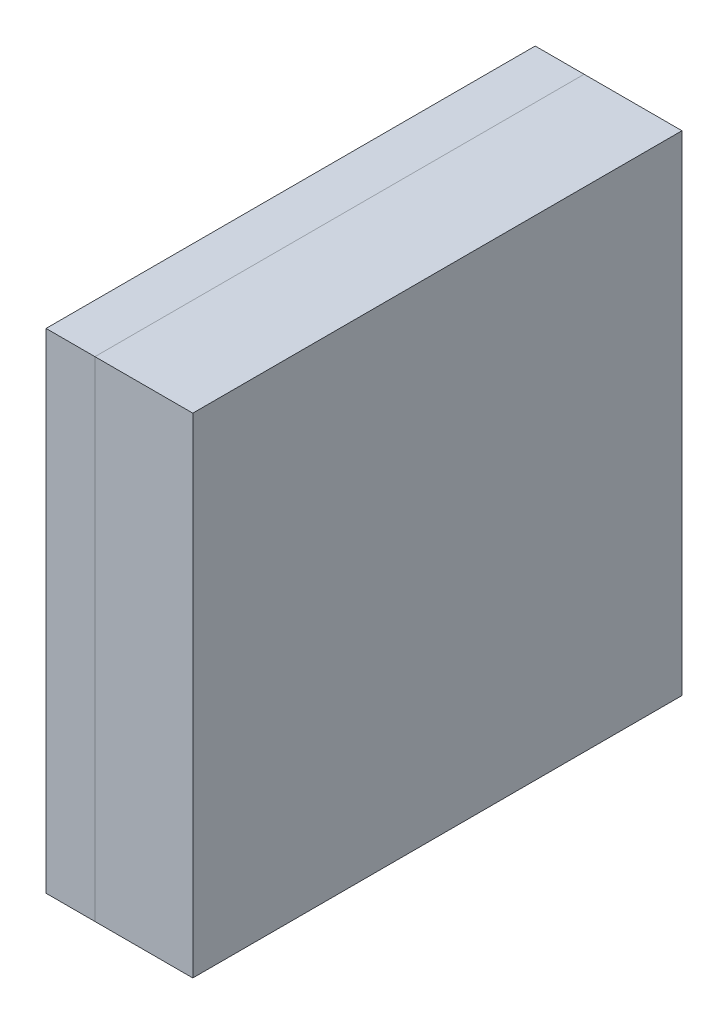
ISO-10303-21;
HEADER;
FILE_DESCRIPTION(('STEP AP214'),'2;1');
FILE_NAME('part.step','',(''),(''),'','','');
FILE_SCHEMA(('AUTOMOTIVE_DESIGN { 1 0 10303 214 1 1 1 1 }'));
ENDSEC;
DATA;
#1=APPLICATION_CONTEXT('core data for automotive mechanical design processes');
#2=APPLICATION_PROTOCOL_DEFINITION('international standard','automotive_design',2000,#1);
#3=PRODUCT_CONTEXT('',#1,'mechanical');
#4=PRODUCT('Part','Part','',(#3));
#5=PRODUCT_RELATED_PRODUCT_CATEGORY('part','',(#4));
#6=PRODUCT_DEFINITION_FORMATION('','',#4);
#7=PRODUCT_DEFINITION_CONTEXT('part definition',#1,'design');
#8=PRODUCT_DEFINITION('design','',#6,#7);
#9=PRODUCT_DEFINITION_SHAPE('','',#8);
#10=(LENGTH_UNIT() NAMED_UNIT(*) SI_UNIT(.MILLI.,.METRE.));
#11=(NAMED_UNIT(*) PLANE_ANGLE_UNIT() SI_UNIT($,.RADIAN.));
#12=(NAMED_UNIT(*) SI_UNIT($,.STERADIAN.) SOLID_ANGLE_UNIT());
#13=UNCERTAINTY_MEASURE_WITH_UNIT(LENGTH_MEASURE(1.E-05),#10,'distance_accuracy_value','');
#14=(GEOMETRIC_REPRESENTATION_CONTEXT(3) GLOBAL_UNCERTAINTY_ASSIGNED_CONTEXT((#13)) GLOBAL_UNIT_ASSIGNED_CONTEXT((#10,
#11,#12)) REPRESENTATION_CONTEXT('',''));
#15=CARTESIAN_POINT('',(0.,0.,0.));
#16=DIRECTION('',(0.,0.,1.));
#17=DIRECTION('',(1.,0.,0.));
#18=AXIS2_PLACEMENT_3D('',#15,#16,#17);
#19=CARTESIAN_POINT('',(300.,500.,-500.));
#20=DIRECTION('',(0.,-1.,0.));
#21=DIRECTION('',(0.,0.,-1.));
#22=AXIS2_PLACEMENT_3D('',#19,#20,#21);
#23=PLANE('',#22);
#24=DIRECTION('',(0.,0.,1.));
#25=VECTOR('',#24,1.);
#26=CARTESIAN_POINT('',(100.,500.,-500.));
#27=LINE('',#26,#25);
#28=CARTESIAN_POINT('',(100.,500.,-500.));
#29=VERTEX_POINT('',#28);
#30=CARTESIAN_POINT('',(100.,500.,500.));
#31=VERTEX_POINT('',#30);
#32=EDGE_CURVE('E128',#29,#31,#27,.T.);
#33=ORIENTED_EDGE('',*,*,#32,.T.);
#34=DIRECTION('',(-1.,0.,0.));
#35=VECTOR('',#34,1.);
#36=CARTESIAN_POINT('',(300.,500.,500.));
#37=LINE('',#36,#35);
#38=CARTESIAN_POINT('',(300.,500.,500.));
#39=VERTEX_POINT('',#38);
#40=EDGE_CURVE('E13',#39,#31,#37,.T.);
#41=ORIENTED_EDGE('',*,*,#40,.F.);
#42=DIRECTION('',(0.,0.,1.));
#43=VECTOR('',#42,1.);
#44=CARTESIAN_POINT('',(300.,500.,-500.));
#45=LINE('',#44,#43);
#46=CARTESIAN_POINT('',(300.,500.,-500.));
#47=VERTEX_POINT('',#46);
#48=EDGE_CURVE('E111',#47,#39,#45,.T.);
#49=ORIENTED_EDGE('',*,*,#48,.F.);
#50=DIRECTION('',(-1.,0.,0.));
#51=VECTOR('',#50,1.);
#52=CARTESIAN_POINT('',(300.,500.,-500.));
#53=LINE('',#52,#51);
#54=EDGE_CURVE('E123',#47,#29,#53,.T.);
#55=ORIENTED_EDGE('',*,*,#54,.T.);
#56=EDGE_LOOP('',(#33,#41,#49,#55));
#57=FACE_BOUND('',#56,.T.);
#58=ADVANCED_FACE('F59',(#57),#23,.F.);
#59=CARTESIAN_POINT('',(300.,500.,500.));
#60=DIRECTION('',(0.,0.,-1.));
#61=DIRECTION('',(-1.,0.,0.));
#62=AXIS2_PLACEMENT_3D('',#59,#60,#61);
#63=PLANE('',#62);
#64=DIRECTION('',(0.,-1.,0.));
#65=VECTOR('',#64,1.);
#66=CARTESIAN_POINT('',(100.,500.,500.));
#67=LINE('',#66,#65);
#68=CARTESIAN_POINT('',(100.,-500.,500.));
#69=VERTEX_POINT('',#68);
#70=EDGE_CURVE('E116',#31,#69,#67,.T.);
#71=ORIENTED_EDGE('',*,*,#70,.T.);
#72=DIRECTION('',(-1.,0.,0.));
#73=VECTOR('',#72,1.);
#74=CARTESIAN_POINT('',(300.,-500.,500.));
#75=LINE('',#74,#73);
#76=CARTESIAN_POINT('',(300.,-500.,500.));
#77=VERTEX_POINT('',#76);
#78=EDGE_CURVE('E68',#77,#69,#75,.T.);
#79=ORIENTED_EDGE('',*,*,#78,.F.);
#80=DIRECTION('',(0.,-1.,0.));
#81=VECTOR('',#80,1.);
#82=CARTESIAN_POINT('',(300.,500.,500.));
#83=LINE('',#82,#81);
#84=EDGE_CURVE('E106',#39,#77,#83,.T.);
#85=ORIENTED_EDGE('',*,*,#84,.F.);
#86=ORIENTED_EDGE('',*,*,#40,.T.);
#87=EDGE_LOOP('',(#71,#79,#85,#86));
#88=FACE_BOUND('',#87,.T.);
#89=ADVANCED_FACE('F115',(#88),#63,.F.);
#90=CARTESIAN_POINT('',(300.,-500.,500.));
#91=DIRECTION('',(0.,1.,0.));
#92=DIRECTION('',(0.,0.,1.));
#93=AXIS2_PLACEMENT_3D('',#90,#91,#92);
#94=PLANE('',#93);
#95=DIRECTION('',(0.,0.,-1.));
#96=VECTOR('',#95,1.);
#97=CARTESIAN_POINT('',(100.,-500.,500.));
#98=LINE('',#97,#96);
#99=CARTESIAN_POINT('',(100.,-500.,-500.));
#100=VERTEX_POINT('',#99);
#101=EDGE_CURVE('E93',#69,#100,#98,.T.);
#102=ORIENTED_EDGE('',*,*,#101,.T.);
#103=DIRECTION('',(-1.,0.,0.));
#104=VECTOR('',#103,1.);
#105=CARTESIAN_POINT('',(300.,-500.,-500.));
#106=LINE('',#105,#104);
#107=CARTESIAN_POINT('',(300.,-500.,-500.));
#108=VERTEX_POINT('',#107);
#109=EDGE_CURVE('E118',#108,#100,#106,.T.);
#110=ORIENTED_EDGE('',*,*,#109,.F.);
#111=DIRECTION('',(0.,0.,-1.));
#112=VECTOR('',#111,1.);
#113=CARTESIAN_POINT('',(300.,-500.,500.));
#114=LINE('',#113,#112);
#115=EDGE_CURVE('E109',#77,#108,#114,.T.);
#116=ORIENTED_EDGE('',*,*,#115,.F.);
#117=ORIENTED_EDGE('',*,*,#78,.T.);
#118=EDGE_LOOP('',(#102,#110,#116,#117));
#119=FACE_BOUND('',#118,.T.);
#120=ADVANCED_FACE('F119',(#119),#94,.F.);
#121=CARTESIAN_POINT('',(300.,-500.,-500.));
#122=DIRECTION('',(0.,0.,1.));
#123=DIRECTION('',(1.,0.,0.));
#124=AXIS2_PLACEMENT_3D('',#121,#122,#123);
#125=PLANE('',#124);
#126=DIRECTION('',(0.,1.,0.));
#127=VECTOR('',#126,1.);
#128=CARTESIAN_POINT('',(100.,-500.,-500.));
#129=LINE('',#128,#127);
#130=EDGE_CURVE('E99',#100,#29,#129,.T.);
#131=ORIENTED_EDGE('',*,*,#130,.T.);
#132=ORIENTED_EDGE('',*,*,#54,.F.);
#133=DIRECTION('',(0.,1.,0.));
#134=VECTOR('',#133,1.);
#135=CARTESIAN_POINT('',(300.,-500.,-500.));
#136=LINE('',#135,#134);
#137=EDGE_CURVE('E76',#108,#47,#136,.T.);
#138=ORIENTED_EDGE('',*,*,#137,.F.);
#139=ORIENTED_EDGE('',*,*,#109,.T.);
#140=EDGE_LOOP('',(#131,#132,#138,#139));
#141=FACE_BOUND('',#140,.T.);
#142=ADVANCED_FACE('F142',(#141),#125,.F.);
#143=CARTESIAN_POINT('',(300.,0.,0.));
#144=DIRECTION('',(1.,0.,0.));
#145=DIRECTION('',(0.,0.,-1.));
#146=AXIS2_PLACEMENT_3D('',#143,#144,#145);
#147=PLANE('',#146);
#148=ORIENTED_EDGE('',*,*,#48,.T.);
#149=ORIENTED_EDGE('',*,*,#84,.T.);
#150=ORIENTED_EDGE('',*,*,#115,.T.);
#151=ORIENTED_EDGE('',*,*,#137,.T.);
#152=EDGE_LOOP('',(#148,#149,#150,#151));
#153=FACE_BOUND('',#152,.T.);
#154=ADVANCED_FACE('F107',(#153),#147,.T.);
#155=CARTESIAN_POINT('',(100.,0.,0.));
#156=DIRECTION('',(1.,0.,0.));
#157=DIRECTION('',(0.,0.,-1.));
#158=AXIS2_PLACEMENT_3D('',#155,#156,#157);
#159=PLANE('',#158);
#160=ORIENTED_EDGE('',*,*,#32,.F.);
#161=ORIENTED_EDGE('',*,*,#130,.F.);
#162=ORIENTED_EDGE('',*,*,#101,.F.);
#163=ORIENTED_EDGE('',*,*,#70,.F.);
#164=EDGE_LOOP('',(#160,#161,#162,#163));
#165=FACE_BOUND('',#164,.T.);
#166=ADVANCED_FACE('F145',(#165),#159,.F.);
#167=CLOSED_SHELL('',(#58,#89,#120,#142,#154,#166));
#168=MANIFOLD_SOLID_BREP('B2',#167);
#169=CARTESIAN_POINT('',(100.,-500.,500.));
#170=DIRECTION('',(0.,0.,1.));
#171=DIRECTION('',(1.,0.,0.));
#172=AXIS2_PLACEMENT_3D('',#169,#170,#171);
#173=PLANE('',#172);
#174=DIRECTION('',(0.,1.,0.));
#175=VECTOR('',#174,1.);
#176=CARTESIAN_POINT('',(0.,-500.,500.));
#177=LINE('',#176,#175);
#178=CARTESIAN_POINT('',(0.,-500.,500.));
#179=VERTEX_POINT('',#178);
#180=CARTESIAN_POINT('',(0.,500.,500.));
#181=VERTEX_POINT('',#180);
#182=EDGE_CURVE('E277',#179,#181,#177,.T.);
#183=ORIENTED_EDGE('',*,*,#182,.F.);
#184=DIRECTION('',(-1.,0.,0.));
#185=VECTOR('',#184,1.);
#186=CARTESIAN_POINT('',(100.,-500.,500.));
#187=LINE('',#186,#185);
#188=CARTESIAN_POINT('',(100.,-500.,500.));
#189=VERTEX_POINT('',#188);
#190=EDGE_CURVE('E57',#189,#179,#187,.T.);
#191=ORIENTED_EDGE('',*,*,#190,.F.);
#192=DIRECTION('',(0.,1.,0.));
#193=VECTOR('',#192,1.);
#194=CARTESIAN_POINT('',(100.,-500.,500.));
#195=LINE('',#194,#193);
#196=CARTESIAN_POINT('',(100.,500.,500.));
#197=VERTEX_POINT('',#196);
#198=EDGE_CURVE('E272',#189,#197,#195,.T.);
#199=ORIENTED_EDGE('',*,*,#198,.T.);
#200=DIRECTION('',(-1.,0.,0.));
#201=VECTOR('',#200,1.);
#202=CARTESIAN_POINT('',(100.,500.,500.));
#203=LINE('',#202,#201);
#204=EDGE_CURVE('E215',#197,#181,#203,.T.);
#205=ORIENTED_EDGE('',*,*,#204,.T.);
#206=EDGE_LOOP('',(#183,#191,#199,#205));
#207=FACE_BOUND('',#206,.T.);
#208=ADVANCED_FACE('F212',(#207),#173,.T.);
#209=CARTESIAN_POINT('',(100.,-500.,500.));
#210=DIRECTION('',(0.,1.,0.));
#211=DIRECTION('',(0.,0.,1.));
#212=AXIS2_PLACEMENT_3D('',#209,#210,#211);
#213=PLANE('',#212);
#214=DIRECTION('',(0.,0.,-1.));
#215=VECTOR('',#214,1.);
#216=CARTESIAN_POINT('',(0.,-500.,500.));
#217=LINE('',#216,#215);
#218=CARTESIAN_POINT('',(0.,-500.,-500.));
#219=VERTEX_POINT('',#218);
#220=EDGE_CURVE('E245',#179,#219,#217,.T.);
#221=ORIENTED_EDGE('',*,*,#220,.T.);
#222=DIRECTION('',(-1.,0.,0.));
#223=VECTOR('',#222,1.);
#224=CARTESIAN_POINT('',(100.,-500.,-500.));
#225=LINE('',#224,#223);
#226=CARTESIAN_POINT('',(100.,-500.,-500.));
#227=VERTEX_POINT('',#226);
#228=EDGE_CURVE('E221',#227,#219,#225,.T.);
#229=ORIENTED_EDGE('',*,*,#228,.F.);
#230=DIRECTION('',(0.,0.,-1.));
#231=VECTOR('',#230,1.);
#232=CARTESIAN_POINT('',(100.,-500.,500.));
#233=LINE('',#232,#231);
#234=EDGE_CURVE('E262',#189,#227,#233,.T.);
#235=ORIENTED_EDGE('',*,*,#234,.F.);
#236=ORIENTED_EDGE('',*,*,#190,.T.);
#237=EDGE_LOOP('',(#221,#229,#235,#236));
#238=FACE_BOUND('',#237,.T.);
#239=ADVANCED_FACE('F287',(#238),#213,.F.);
#240=CARTESIAN_POINT('',(100.,-500.,-500.));
#241=DIRECTION('',(0.,0.,1.));
#242=DIRECTION('',(1.,0.,0.));
#243=AXIS2_PLACEMENT_3D('',#240,#241,#242);
#244=PLANE('',#243);
#245=DIRECTION('',(0.,1.,0.));
#246=VECTOR('',#245,1.);
#247=CARTESIAN_POINT('',(0.,-500.,-500.));
#248=LINE('',#247,#246);
#249=CARTESIAN_POINT('',(0.,500.,-500.));
#250=VERTEX_POINT('',#249);
#251=EDGE_CURVE('E269',#219,#250,#248,.T.);
#252=ORIENTED_EDGE('',*,*,#251,.T.);
#253=DIRECTION('',(-1.,0.,0.));
#254=VECTOR('',#253,1.);
#255=CARTESIAN_POINT('',(100.,500.,-500.));
#256=LINE('',#255,#254);
#257=CARTESIAN_POINT('',(100.,500.,-500.));
#258=VERTEX_POINT('',#257);
#259=EDGE_CURVE('E266',#258,#250,#256,.T.);
#260=ORIENTED_EDGE('',*,*,#259,.F.);
#261=DIRECTION('',(0.,1.,0.));
#262=VECTOR('',#261,1.);
#263=CARTESIAN_POINT('',(100.,-500.,-500.));
#264=LINE('',#263,#262);
#265=EDGE_CURVE('E257',#227,#258,#264,.T.);
#266=ORIENTED_EDGE('',*,*,#265,.F.);
#267=ORIENTED_EDGE('',*,*,#228,.T.);
#268=EDGE_LOOP('',(#252,#260,#266,#267));
#269=FACE_BOUND('',#268,.T.);
#270=ADVANCED_FACE('F267',(#269),#244,.F.);
#271=CARTESIAN_POINT('',(100.,500.,500.));
#272=DIRECTION('',(0.,1.,0.));
#273=DIRECTION('',(0.,0.,1.));
#274=AXIS2_PLACEMENT_3D('',#271,#272,#273);
#275=PLANE('',#274);
#276=DIRECTION('',(0.,0.,-1.));
#277=VECTOR('',#276,1.);
#278=CARTESIAN_POINT('',(0.,500.,500.));
#279=LINE('',#278,#277);
#280=EDGE_CURVE('E280',#181,#250,#279,.T.);
#281=ORIENTED_EDGE('',*,*,#280,.F.);
#282=ORIENTED_EDGE('',*,*,#204,.F.);
#283=DIRECTION('',(0.,0.,-1.));
#284=VECTOR('',#283,1.);
#285=CARTESIAN_POINT('',(100.,500.,500.));
#286=LINE('',#285,#284);
#287=EDGE_CURVE('E261',#197,#258,#286,.T.);
#288=ORIENTED_EDGE('',*,*,#287,.T.);
#289=ORIENTED_EDGE('',*,*,#259,.T.);
#290=EDGE_LOOP('',(#281,#282,#288,#289));
#291=FACE_BOUND('',#290,.T.);
#292=ADVANCED_FACE('F271',(#291),#275,.T.);
#293=CARTESIAN_POINT('',(100.,0.,0.));
#294=DIRECTION('',(-1.,0.,0.));
#295=DIRECTION('',(0.,0.,1.));
#296=AXIS2_PLACEMENT_3D('',#293,#294,#295);
#297=PLANE('',#296);
#298=ORIENTED_EDGE('',*,*,#198,.F.);
#299=ORIENTED_EDGE('',*,*,#234,.T.);
#300=ORIENTED_EDGE('',*,*,#265,.T.);
#301=ORIENTED_EDGE('',*,*,#287,.F.);
#302=EDGE_LOOP('',(#298,#299,#300,#301));
#303=FACE_BOUND('',#302,.T.);
#304=ADVANCED_FACE('F260',(#303),#297,.F.);
#305=CARTESIAN_POINT('',(0.,0.,0.));
#306=DIRECTION('',(-1.,0.,0.));
#307=DIRECTION('',(0.,0.,1.));
#308=AXIS2_PLACEMENT_3D('',#305,#306,#307);
#309=PLANE('',#308);
#310=ORIENTED_EDGE('',*,*,#182,.T.);
#311=ORIENTED_EDGE('',*,*,#280,.T.);
#312=ORIENTED_EDGE('',*,*,#251,.F.);
#313=ORIENTED_EDGE('',*,*,#220,.F.);
#314=EDGE_LOOP('',(#310,#311,#312,#313));
#315=FACE_BOUND('',#314,.T.);
#316=ADVANCED_FACE('F285',(#315),#309,.T.);
#317=CLOSED_SHELL('',(#208,#239,#270,#292,#304,#316));
#318=MANIFOLD_SOLID_BREP('B7',#317);
#319=ADVANCED_BREP_SHAPE_REPRESENTATION('',(#18,#168,#318),#14);
#320=SHAPE_DEFINITION_REPRESENTATION(#9,#319);
ENDSEC;
END-ISO-10303-21;
